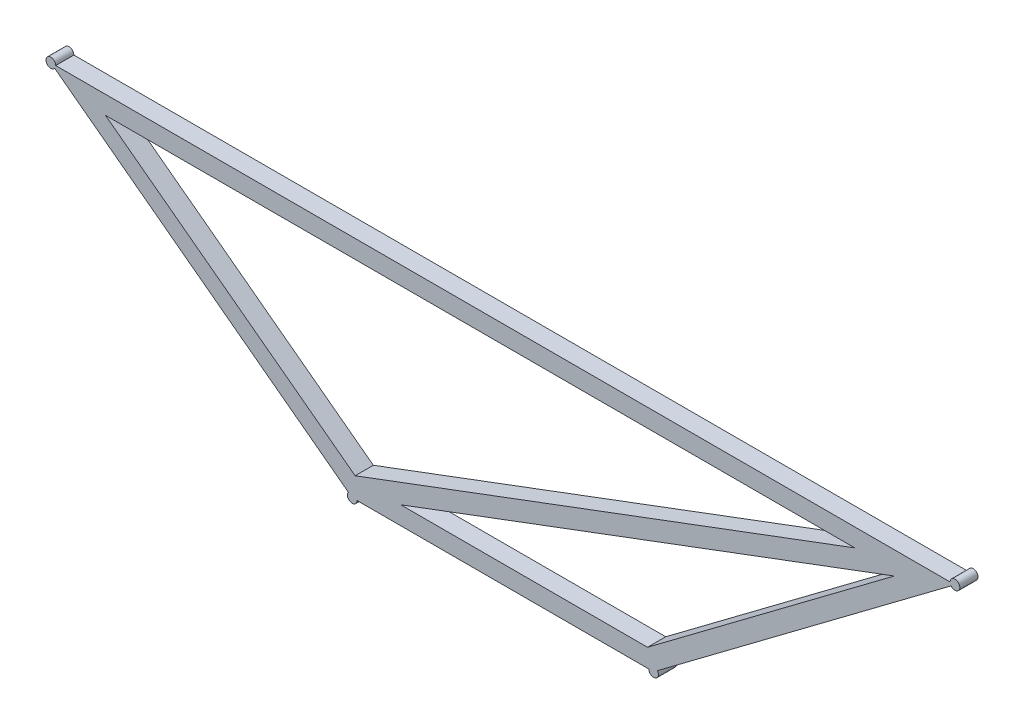
ISO-10303-21;
HEADER;
FILE_DESCRIPTION(('STEP AP214'),'2;1');
FILE_NAME('part.step','',(''),(''),'','','');
FILE_SCHEMA(('AUTOMOTIVE_DESIGN { 1 0 10303 214 1 1 1 1 }'));
ENDSEC;
DATA;
#1=APPLICATION_CONTEXT('core data for automotive mechanical design processes');
#2=APPLICATION_PROTOCOL_DEFINITION('international standard','automotive_design',2000,#1);
#3=PRODUCT_CONTEXT('',#1,'mechanical');
#4=PRODUCT('Part','Part','',(#3));
#5=PRODUCT_RELATED_PRODUCT_CATEGORY('part','',(#4));
#6=PRODUCT_DEFINITION_FORMATION('','',#4);
#7=PRODUCT_DEFINITION_CONTEXT('part definition',#1,'design');
#8=PRODUCT_DEFINITION('design','',#6,#7);
#9=PRODUCT_DEFINITION_SHAPE('','',#8);
#10=(LENGTH_UNIT() NAMED_UNIT(*) SI_UNIT(.MILLI.,.METRE.));
#11=(NAMED_UNIT(*) PLANE_ANGLE_UNIT() SI_UNIT($,.RADIAN.));
#12=(NAMED_UNIT(*) SI_UNIT($,.STERADIAN.) SOLID_ANGLE_UNIT());
#13=UNCERTAINTY_MEASURE_WITH_UNIT(LENGTH_MEASURE(1.E-05),#10,'distance_accuracy_value','');
#14=(GEOMETRIC_REPRESENTATION_CONTEXT(3) GLOBAL_UNCERTAINTY_ASSIGNED_CONTEXT((#13)) GLOBAL_UNIT_ASSIGNED_CONTEXT((#10,
#11,#12)) REPRESENTATION_CONTEXT('',''));
#15=CARTESIAN_POINT('',(0.,0.,0.));
#16=DIRECTION('',(0.,0.,1.));
#17=DIRECTION('',(1.,0.,0.));
#18=AXIS2_PLACEMENT_3D('',#15,#16,#17);
#19=CARTESIAN_POINT('',(-400.,300.,24.14));
#20=DIRECTION('',(0.,0.,1.));
#21=DIRECTION('',(1.,0.,0.));
#22=AXIS2_PLACEMENT_3D('',#19,#20,#21);
#23=PLANE('',#22);
#24=CARTESIAN_POINT('',(-400.,300.,24.14));
#25=DIRECTION('',(0.,0.,1.));
#26=DIRECTION('',(1.,0.,0.));
#27=AXIS2_PLACEMENT_3D('',#24,#25,#26);
#28=CIRCLE('',#27,6.41999999999997);
#29=CARTESIAN_POINT('',(-393.58,300.,24.14));
#30=VERTEX_POINT('',#29);
#31=CARTESIAN_POINT('',(-394.864,296.148,24.14));
#32=VERTEX_POINT('',#31);
#33=EDGE_CURVE('E216',#30,#32,#28,.T.);
#34=ORIENTED_EDGE('',*,*,#33,.T.);
#35=DIRECTION('',(0.8,-0.6,0.));
#36=VECTOR('',#35,1.);
#37=CARTESIAN_POINT('',(-394.864,296.148,24.14));
#38=LINE('',#37,#36);
#39=CARTESIAN_POINT('',(-5.13600000000002,3.85199999999998,24.14));
#40=VERTEX_POINT('',#39);
#41=EDGE_CURVE('E220',#32,#40,#38,.T.);
#42=ORIENTED_EDGE('',*,*,#41,.T.);
#43=CARTESIAN_POINT('',(0.,0.,24.14));
#44=DIRECTION('',(0.,0.,1.));
#45=DIRECTION('',(1.,0.,0.));
#46=AXIS2_PLACEMENT_3D('',#43,#44,#45);
#47=CIRCLE('',#46,6.42);
#48=CARTESIAN_POINT('',(6.42,0.,24.14));
#49=VERTEX_POINT('',#48);
#50=EDGE_CURVE('E224',#40,#49,#47,.T.);
#51=ORIENTED_EDGE('',*,*,#50,.T.);
#52=DIRECTION('',(1.,0.,0.));
#53=VECTOR('',#52,1.);
#54=CARTESIAN_POINT('',(6.42,0.,24.14));
#55=LINE('',#54,#53);
#56=CARTESIAN_POINT('',(393.58,0.,24.14));
#57=VERTEX_POINT('',#56);
#58=EDGE_CURVE('E227',#49,#57,#55,.T.);
#59=ORIENTED_EDGE('',*,*,#58,.T.);
#60=CARTESIAN_POINT('',(400.,0.,24.14));
#61=DIRECTION('',(0.,0.,1.));
#62=DIRECTION('',(1.,0.,0.));
#63=AXIS2_PLACEMENT_3D('',#60,#61,#62);
#64=CIRCLE('',#63,6.41999999999998);
#65=CARTESIAN_POINT('',(405.136,3.85199999999999,24.14));
#66=VERTEX_POINT('',#65);
#67=EDGE_CURVE('E230',#57,#66,#64,.T.);
#68=ORIENTED_EDGE('',*,*,#67,.T.);
#69=DIRECTION('',(0.8,0.6,0.));
#70=VECTOR('',#69,1.);
#71=CARTESIAN_POINT('',(405.136,3.85199999999999,24.14));
#72=LINE('',#71,#70);
#73=CARTESIAN_POINT('',(794.864,296.148,24.14));
#74=VERTEX_POINT('',#73);
#75=EDGE_CURVE('E233',#66,#74,#72,.T.);
#76=ORIENTED_EDGE('',*,*,#75,.T.);
#77=CARTESIAN_POINT('',(800.,300.,24.14));
#78=DIRECTION('',(0.,0.,1.));
#79=DIRECTION('',(1.,0.,0.));
#80=AXIS2_PLACEMENT_3D('',#77,#78,#79);
#81=CIRCLE('',#80,6.41999999999995);
#82=CARTESIAN_POINT('',(793.58,300.,24.14));
#83=VERTEX_POINT('',#82);
#84=EDGE_CURVE('E236',#74,#83,#81,.T.);
#85=ORIENTED_EDGE('',*,*,#84,.T.);
#86=DIRECTION('',(-1.,0.,0.));
#87=VECTOR('',#86,1.);
#88=CARTESIAN_POINT('',(793.58,300.,24.14));
#89=LINE('',#88,#87);
#90=EDGE_CURVE('E239',#83,#30,#89,.T.);
#91=ORIENTED_EDGE('',*,*,#90,.T.);
#92=EDGE_LOOP('',(#34,#42,#51,#59,#68,#76,#85,#91));
#93=FACE_BOUND('',#92,.T.);
#94=DIRECTION('',(0.8,-0.6,0.));
#95=VECTOR('',#94,1.);
#96=CARTESIAN_POINT('',(-327.58,275.86,24.14));
#97=LINE('',#96,#95);
#98=CARTESIAN_POINT('',(-327.58,275.86,24.14));
#99=VERTEX_POINT('',#98);
#100=CARTESIAN_POINT('',(3.90530550978163,27.2460208676638,24.14));
#101=VERTEX_POINT('',#100);
#102=EDGE_CURVE('E186',#99,#101,#97,.T.);
#103=ORIENTED_EDGE('',*,*,#102,.F.);
#104=DIRECTION('',(-1.,0.,0.));
#105=VECTOR('',#104,1.);
#106=CARTESIAN_POINT('',(666.875916529345,275.86,24.14));
#107=LINE('',#106,#105);
#108=CARTESIAN_POINT('',(666.875916529345,275.86,24.14));
#109=VERTEX_POINT('',#108);
#110=EDGE_CURVE('E183',#109,#99,#107,.T.);
#111=ORIENTED_EDGE('',*,*,#110,.F.);
#112=DIRECTION('',(0.936329177569045,0.351123441588392,0.));
#113=VECTOR('',#112,1.);
#114=CARTESIAN_POINT('',(3.90530550978168,27.2460208676638,24.14));
#115=LINE('',#114,#113);
#116=EDGE_CURVE('E191',#101,#109,#115,.T.);
#117=ORIENTED_EDGE('',*,*,#116,.F.);
#118=EDGE_LOOP('',(#103,#111,#117));
#119=FACE_BOUND('',#118,.T.);
#120=DIRECTION('',(-0.936329177569044,-0.351123441588392,0.));
#121=VECTOR('',#120,1.);
#122=CARTESIAN_POINT('',(64.3733333333334,24.14,24.14));
#123=LINE('',#122,#121);
#124=CARTESIAN_POINT('',(719.533333333334,269.825,24.14));
#125=VERTEX_POINT('',#124);
#126=CARTESIAN_POINT('',(64.3733333333333,24.1400000000001,24.14));
#127=VERTEX_POINT('',#126);
#128=EDGE_CURVE('E156',#125,#127,#123,.T.);
#129=ORIENTED_EDGE('',*,*,#128,.F.);
#130=DIRECTION('',(0.8,0.6,0.));
#131=VECTOR('',#130,1.);
#132=CARTESIAN_POINT('',(391.953333333333,24.14,24.14));
#133=LINE('',#132,#131);
#134=CARTESIAN_POINT('',(391.953333333333,24.14,24.14));
#135=VERTEX_POINT('',#134);
#136=EDGE_CURVE('E147',#135,#125,#133,.T.);
#137=ORIENTED_EDGE('',*,*,#136,.F.);
#138=DIRECTION('',(1.,0.,0.));
#139=VECTOR('',#138,1.);
#140=CARTESIAN_POINT('',(64.3733333333334,24.14,24.14));
#141=LINE('',#140,#139);
#142=EDGE_CURVE('E166',#127,#135,#141,.T.);
#143=ORIENTED_EDGE('',*,*,#142,.F.);
#144=EDGE_LOOP('',(#129,#137,#143));
#145=FACE_BOUND('',#144,.T.);
#146=ADVANCED_FACE('F45',(#93,#119,#145),#23,.T.);
#147=CARTESIAN_POINT('',(-400.,300.,0.));
#148=DIRECTION('',(0.,0.,1.));
#149=DIRECTION('',(1.,0.,0.));
#150=AXIS2_PLACEMENT_3D('',#147,#148,#149);
#151=PLANE('',#150);
#152=DIRECTION('',(-1.,0.,0.));
#153=VECTOR('',#152,1.);
#154=CARTESIAN_POINT('',(666.875916529345,275.86,0.));
#155=LINE('',#154,#153);
#156=CARTESIAN_POINT('',(666.875916529345,275.86,0.));
#157=VERTEX_POINT('',#156);
#158=CARTESIAN_POINT('',(-327.58,275.86,0.));
#159=VERTEX_POINT('',#158);
#160=EDGE_CURVE('E164',#157,#159,#155,.T.);
#161=ORIENTED_EDGE('',*,*,#160,.T.);
#162=DIRECTION('',(0.8,-0.6,0.));
#163=VECTOR('',#162,1.);
#164=CARTESIAN_POINT('',(-327.58,275.86,0.));
#165=LINE('',#164,#163);
#166=CARTESIAN_POINT('',(3.90530550978168,27.2460208676638,0.));
#167=VERTEX_POINT('',#166);
#168=EDGE_CURVE('E198',#159,#167,#165,.T.);
#169=ORIENTED_EDGE('',*,*,#168,.T.);
#170=DIRECTION('',(0.936329177569045,0.351123441588392,0.));
#171=VECTOR('',#170,1.);
#172=CARTESIAN_POINT('',(3.90530550978168,27.2460208676638,0.));
#173=LINE('',#172,#171);
#174=EDGE_CURVE('E187',#167,#157,#173,.T.);
#175=ORIENTED_EDGE('',*,*,#174,.T.);
#176=EDGE_LOOP('',(#161,#169,#175));
#177=FACE_BOUND('',#176,.T.);
#178=CARTESIAN_POINT('',(-400.,300.,0.));
#179=DIRECTION('',(0.,0.,1.));
#180=DIRECTION('',(1.,0.,0.));
#181=AXIS2_PLACEMENT_3D('',#178,#179,#180);
#182=CIRCLE('',#181,6.41999999999997);
#183=CARTESIAN_POINT('',(-393.58,300.,0.));
#184=VERTEX_POINT('',#183);
#185=CARTESIAN_POINT('',(-394.864,296.148,0.));
#186=VERTEX_POINT('',#185);
#187=EDGE_CURVE('E215',#184,#186,#182,.T.);
#188=ORIENTED_EDGE('',*,*,#187,.F.);
#189=DIRECTION('',(-1.,0.,0.));
#190=VECTOR('',#189,1.);
#191=CARTESIAN_POINT('',(793.58,300.,0.));
#192=LINE('',#191,#190);
#193=CARTESIAN_POINT('',(793.58,300.,0.));
#194=VERTEX_POINT('',#193);
#195=EDGE_CURVE('E221',#194,#184,#192,.T.);
#196=ORIENTED_EDGE('',*,*,#195,.F.);
#197=CARTESIAN_POINT('',(800.,300.,0.));
#198=DIRECTION('',(0.,0.,1.));
#199=DIRECTION('',(1.,0.,0.));
#200=AXIS2_PLACEMENT_3D('',#197,#198,#199);
#201=CIRCLE('',#200,6.41999999999995);
#202=CARTESIAN_POINT('',(794.864,296.148,0.));
#203=VERTEX_POINT('',#202);
#204=EDGE_CURVE('E261',#203,#194,#201,.T.);
#205=ORIENTED_EDGE('',*,*,#204,.F.);
#206=DIRECTION('',(0.8,0.6,0.));
#207=VECTOR('',#206,1.);
#208=CARTESIAN_POINT('',(405.136,3.85199999999999,0.));
#209=LINE('',#208,#207);
#210=CARTESIAN_POINT('',(405.136,3.85199999999999,0.));
#211=VERTEX_POINT('',#210);
#212=EDGE_CURVE('E258',#211,#203,#209,.T.);
#213=ORIENTED_EDGE('',*,*,#212,.F.);
#214=CARTESIAN_POINT('',(400.,0.,0.));
#215=DIRECTION('',(0.,0.,1.));
#216=DIRECTION('',(1.,0.,0.));
#217=AXIS2_PLACEMENT_3D('',#214,#215,#216);
#218=CIRCLE('',#217,6.41999999999998);
#219=CARTESIAN_POINT('',(393.58,0.,0.));
#220=VERTEX_POINT('',#219);
#221=EDGE_CURVE('E255',#220,#211,#218,.T.);
#222=ORIENTED_EDGE('',*,*,#221,.F.);
#223=DIRECTION('',(1.,0.,0.));
#224=VECTOR('',#223,1.);
#225=CARTESIAN_POINT('',(6.42,0.,0.));
#226=LINE('',#225,#224);
#227=CARTESIAN_POINT('',(6.42,0.,0.));
#228=VERTEX_POINT('',#227);
#229=EDGE_CURVE('E252',#228,#220,#226,.T.);
#230=ORIENTED_EDGE('',*,*,#229,.F.);
#231=CARTESIAN_POINT('',(0.,0.,0.));
#232=DIRECTION('',(0.,0.,1.));
#233=DIRECTION('',(1.,0.,0.));
#234=AXIS2_PLACEMENT_3D('',#231,#232,#233);
#235=CIRCLE('',#234,6.42);
#236=CARTESIAN_POINT('',(-5.13600000000002,3.85199999999998,0.));
#237=VERTEX_POINT('',#236);
#238=EDGE_CURVE('E249',#237,#228,#235,.T.);
#239=ORIENTED_EDGE('',*,*,#238,.F.);
#240=DIRECTION('',(0.8,-0.6,0.));
#241=VECTOR('',#240,1.);
#242=CARTESIAN_POINT('',(-394.864,296.148,0.));
#243=LINE('',#242,#241);
#244=EDGE_CURVE('E246',#186,#237,#243,.T.);
#245=ORIENTED_EDGE('',*,*,#244,.F.);
#246=EDGE_LOOP('',(#188,#196,#205,#213,#222,#230,#239,#245));
#247=FACE_BOUND('',#246,.T.);
#248=DIRECTION('',(0.8,0.6,0.));
#249=VECTOR('',#248,1.);
#250=CARTESIAN_POINT('',(391.953333333333,24.14,0.));
#251=LINE('',#250,#249);
#252=CARTESIAN_POINT('',(391.953333333333,24.1400000000001,0.));
#253=VERTEX_POINT('',#252);
#254=CARTESIAN_POINT('',(719.533333333334,269.825,0.));
#255=VERTEX_POINT('',#254);
#256=EDGE_CURVE('E69',#253,#255,#251,.T.);
#257=ORIENTED_EDGE('',*,*,#256,.T.);
#258=DIRECTION('',(-0.936329177569044,-0.351123441588392,0.));
#259=VECTOR('',#258,1.);
#260=CARTESIAN_POINT('',(64.3733333333334,24.14,0.));
#261=LINE('',#260,#259);
#262=CARTESIAN_POINT('',(64.3733333333334,24.14,0.));
#263=VERTEX_POINT('',#262);
#264=EDGE_CURVE('E162',#255,#263,#261,.T.);
#265=ORIENTED_EDGE('',*,*,#264,.T.);
#266=DIRECTION('',(1.,0.,0.));
#267=VECTOR('',#266,1.);
#268=CARTESIAN_POINT('',(64.3733333333334,24.14,0.));
#269=LINE('',#268,#267);
#270=EDGE_CURVE('E157',#263,#253,#269,.T.);
#271=ORIENTED_EDGE('',*,*,#270,.T.);
#272=EDGE_LOOP('',(#257,#265,#271));
#273=FACE_BOUND('',#272,.T.);
#274=ADVANCED_FACE('F300',(#177,#247,#273),#151,.F.);
#275=CARTESIAN_POINT('',(-400.,300.,24.14));
#276=DIRECTION('',(0.,0.,-1.));
#277=DIRECTION('',(-1.,0.,0.));
#278=AXIS2_PLACEMENT_3D('',#275,#276,#277);
#279=CYLINDRICAL_SURFACE('',#278,6.41999999999997);
#280=ORIENTED_EDGE('',*,*,#187,.T.);
#281=DIRECTION('',(0.,0.,-1.));
#282=VECTOR('',#281,1.);
#283=CARTESIAN_POINT('',(-394.864,296.148,24.14));
#284=LINE('',#283,#282);
#285=EDGE_CURVE('E11',#32,#186,#284,.T.);
#286=ORIENTED_EDGE('',*,*,#285,.F.);
#287=ORIENTED_EDGE('',*,*,#33,.F.);
#288=DIRECTION('',(0.,0.,-1.));
#289=VECTOR('',#288,1.);
#290=CARTESIAN_POINT('',(-393.58,300.,24.14));
#291=LINE('',#290,#289);
#292=EDGE_CURVE('E242',#30,#184,#291,.T.);
#293=ORIENTED_EDGE('',*,*,#292,.T.);
#294=EDGE_LOOP('',(#280,#286,#287,#293));
#295=FACE_BOUND('',#294,.T.);
#296=ADVANCED_FACE('F47',(#295),#279,.T.);
#297=CARTESIAN_POINT('',(-394.864,296.148,24.14));
#298=DIRECTION('',(0.6,0.8,0.));
#299=DIRECTION('',(-0.8,0.6,0.));
#300=AXIS2_PLACEMENT_3D('',#297,#298,#299);
#301=PLANE('',#300);
#302=ORIENTED_EDGE('',*,*,#244,.T.);
#303=DIRECTION('',(0.,0.,-1.));
#304=VECTOR('',#303,1.);
#305=CARTESIAN_POINT('',(-5.13600000000002,3.85199999999998,24.14));
#306=LINE('',#305,#304);
#307=EDGE_CURVE('E54',#40,#237,#306,.T.);
#308=ORIENTED_EDGE('',*,*,#307,.F.);
#309=ORIENTED_EDGE('',*,*,#41,.F.);
#310=ORIENTED_EDGE('',*,*,#285,.T.);
#311=EDGE_LOOP('',(#302,#308,#309,#310));
#312=FACE_BOUND('',#311,.T.);
#313=ADVANCED_FACE('F318',(#312),#301,.F.);
#314=CARTESIAN_POINT('',(0.,0.,24.14));
#315=DIRECTION('',(0.,0.,-1.));
#316=DIRECTION('',(-1.,0.,0.));
#317=AXIS2_PLACEMENT_3D('',#314,#315,#316);
#318=CYLINDRICAL_SURFACE('',#317,6.42);
#319=ORIENTED_EDGE('',*,*,#238,.T.);
#320=DIRECTION('',(0.,0.,-1.));
#321=VECTOR('',#320,1.);
#322=CARTESIAN_POINT('',(6.42,0.,24.14));
#323=LINE('',#322,#321);
#324=EDGE_CURVE('E285',#49,#228,#323,.T.);
#325=ORIENTED_EDGE('',*,*,#324,.F.);
#326=ORIENTED_EDGE('',*,*,#50,.F.);
#327=ORIENTED_EDGE('',*,*,#307,.T.);
#328=EDGE_LOOP('',(#319,#325,#326,#327));
#329=FACE_BOUND('',#328,.T.);
#330=ADVANCED_FACE('F294',(#329),#318,.T.);
#331=CARTESIAN_POINT('',(6.42,0.,24.14));
#332=DIRECTION('',(0.,1.,0.));
#333=DIRECTION('',(0.,0.,1.));
#334=AXIS2_PLACEMENT_3D('',#331,#332,#333);
#335=PLANE('',#334);
#336=ORIENTED_EDGE('',*,*,#229,.T.);
#337=DIRECTION('',(0.,0.,-1.));
#338=VECTOR('',#337,1.);
#339=CARTESIAN_POINT('',(393.58,0.,24.14));
#340=LINE('',#339,#338);
#341=EDGE_CURVE('E281',#57,#220,#340,.T.);
#342=ORIENTED_EDGE('',*,*,#341,.F.);
#343=ORIENTED_EDGE('',*,*,#58,.F.);
#344=ORIENTED_EDGE('',*,*,#324,.T.);
#345=EDGE_LOOP('',(#336,#342,#343,#344));
#346=FACE_BOUND('',#345,.T.);
#347=ADVANCED_FACE('F306',(#346),#335,.F.);
#348=CARTESIAN_POINT('',(400.,0.,24.14));
#349=DIRECTION('',(0.,0.,-1.));
#350=DIRECTION('',(-1.,0.,0.));
#351=AXIS2_PLACEMENT_3D('',#348,#349,#350);
#352=CYLINDRICAL_SURFACE('',#351,6.41999999999998);
#353=ORIENTED_EDGE('',*,*,#221,.T.);
#354=DIRECTION('',(0.,0.,-1.));
#355=VECTOR('',#354,1.);
#356=CARTESIAN_POINT('',(405.136,3.85199999999999,24.14));
#357=LINE('',#356,#355);
#358=EDGE_CURVE('E277',#66,#211,#357,.T.);
#359=ORIENTED_EDGE('',*,*,#358,.F.);
#360=ORIENTED_EDGE('',*,*,#67,.F.);
#361=ORIENTED_EDGE('',*,*,#341,.T.);
#362=EDGE_LOOP('',(#353,#359,#360,#361));
#363=FACE_BOUND('',#362,.T.);
#364=ADVANCED_FACE('F310',(#363),#352,.T.);
#365=CARTESIAN_POINT('',(405.136,3.85199999999999,24.14));
#366=DIRECTION('',(-0.6,0.8,0.));
#367=DIRECTION('',(-0.8,-0.6,0.));
#368=AXIS2_PLACEMENT_3D('',#365,#366,#367);
#369=PLANE('',#368);
#370=ORIENTED_EDGE('',*,*,#212,.T.);
#371=DIRECTION('',(0.,0.,-1.));
#372=VECTOR('',#371,1.);
#373=CARTESIAN_POINT('',(794.864,296.148,24.14));
#374=LINE('',#373,#372);
#375=EDGE_CURVE('E273',#74,#203,#374,.T.);
#376=ORIENTED_EDGE('',*,*,#375,.F.);
#377=ORIENTED_EDGE('',*,*,#75,.F.);
#378=ORIENTED_EDGE('',*,*,#358,.T.);
#379=EDGE_LOOP('',(#370,#376,#377,#378));
#380=FACE_BOUND('',#379,.T.);
#381=ADVANCED_FACE('F331',(#380),#369,.F.);
#382=CARTESIAN_POINT('',(800.,300.,24.14));
#383=DIRECTION('',(0.,0.,-1.));
#384=DIRECTION('',(-1.,0.,0.));
#385=AXIS2_PLACEMENT_3D('',#382,#383,#384);
#386=CYLINDRICAL_SURFACE('',#385,6.41999999999995);
#387=ORIENTED_EDGE('',*,*,#204,.T.);
#388=DIRECTION('',(0.,0.,-1.));
#389=VECTOR('',#388,1.);
#390=CARTESIAN_POINT('',(793.58,300.,24.14));
#391=LINE('',#390,#389);
#392=EDGE_CURVE('E269',#83,#194,#391,.T.);
#393=ORIENTED_EDGE('',*,*,#392,.F.);
#394=ORIENTED_EDGE('',*,*,#84,.F.);
#395=ORIENTED_EDGE('',*,*,#375,.T.);
#396=EDGE_LOOP('',(#387,#393,#394,#395));
#397=FACE_BOUND('',#396,.T.);
#398=ADVANCED_FACE('F329',(#397),#386,.T.);
#399=CARTESIAN_POINT('',(793.58,300.,24.14));
#400=DIRECTION('',(0.,-1.,0.));
#401=DIRECTION('',(1.,0.,0.));
#402=AXIS2_PLACEMENT_3D('',#399,#400,#401);
#403=PLANE('',#402);
#404=ORIENTED_EDGE('',*,*,#195,.T.);
#405=ORIENTED_EDGE('',*,*,#292,.F.);
#406=ORIENTED_EDGE('',*,*,#90,.F.);
#407=ORIENTED_EDGE('',*,*,#392,.T.);
#408=EDGE_LOOP('',(#404,#405,#406,#407));
#409=FACE_BOUND('',#408,.T.);
#410=ADVANCED_FACE('F324',(#409),#403,.F.);
#411=CARTESIAN_POINT('',(666.875916529345,275.86,24.14));
#412=DIRECTION('',(0.,-1.,0.));
#413=DIRECTION('',(1.,0.,0.));
#414=AXIS2_PLACEMENT_3D('',#411,#412,#413);
#415=PLANE('',#414);
#416=ORIENTED_EDGE('',*,*,#160,.F.);
#417=DIRECTION('',(0.,0.,-1.));
#418=VECTOR('',#417,1.);
#419=CARTESIAN_POINT('',(666.875916529345,275.86,24.14));
#420=LINE('',#419,#418);
#421=EDGE_CURVE('E194',#109,#157,#420,.T.);
#422=ORIENTED_EDGE('',*,*,#421,.F.);
#423=ORIENTED_EDGE('',*,*,#110,.T.);
#424=DIRECTION('',(0.,0.,-1.));
#425=VECTOR('',#424,1.);
#426=CARTESIAN_POINT('',(-327.58,275.86,24.14));
#427=LINE('',#426,#425);
#428=EDGE_CURVE('E211',#99,#159,#427,.T.);
#429=ORIENTED_EDGE('',*,*,#428,.T.);
#430=EDGE_LOOP('',(#416,#422,#423,#429));
#431=FACE_BOUND('',#430,.T.);
#432=ADVANCED_FACE('F348',(#431),#415,.T.);
#433=CARTESIAN_POINT('',(-327.58,275.86,24.14));
#434=DIRECTION('',(0.6,0.8,0.));
#435=DIRECTION('',(-0.8,0.6,0.));
#436=AXIS2_PLACEMENT_3D('',#433,#434,#435);
#437=PLANE('',#436);
#438=ORIENTED_EDGE('',*,*,#168,.F.);
#439=ORIENTED_EDGE('',*,*,#428,.F.);
#440=ORIENTED_EDGE('',*,*,#102,.T.);
#441=DIRECTION('',(0.,0.,-1.));
#442=VECTOR('',#441,1.);
#443=CARTESIAN_POINT('',(3.90530550978168,27.2460208676638,24.14));
#444=LINE('',#443,#442);
#445=EDGE_CURVE('E208',#101,#167,#444,.T.);
#446=ORIENTED_EDGE('',*,*,#445,.T.);
#447=EDGE_LOOP('',(#438,#439,#440,#446));
#448=FACE_BOUND('',#447,.T.);
#449=ADVANCED_FACE('F355',(#448),#437,.T.);
#450=CARTESIAN_POINT('',(3.90530550978168,27.2460208676638,24.14));
#451=DIRECTION('',(-0.351123441588392,0.936329177569045,0.));
#452=DIRECTION('',(-0.936329177569045,-0.351123441588392,0.));
#453=AXIS2_PLACEMENT_3D('',#450,#451,#452);
#454=PLANE('',#453);
#455=ORIENTED_EDGE('',*,*,#174,.F.);
#456=ORIENTED_EDGE('',*,*,#445,.F.);
#457=ORIENTED_EDGE('',*,*,#116,.T.);
#458=ORIENTED_EDGE('',*,*,#421,.T.);
#459=EDGE_LOOP('',(#455,#456,#457,#458));
#460=FACE_BOUND('',#459,.T.);
#461=ADVANCED_FACE('F360',(#460),#454,.T.);
#462=CARTESIAN_POINT('',(391.953333333333,24.14,24.14));
#463=DIRECTION('',(-0.6,0.8,0.));
#464=DIRECTION('',(-0.8,-0.6,0.));
#465=AXIS2_PLACEMENT_3D('',#462,#463,#464);
#466=PLANE('',#465);
#467=ORIENTED_EDGE('',*,*,#256,.F.);
#468=DIRECTION('',(0.,0.,-1.));
#469=VECTOR('',#468,1.);
#470=CARTESIAN_POINT('',(391.953333333333,24.14,24.14));
#471=LINE('',#470,#469);
#472=EDGE_CURVE('E151',#135,#253,#471,.T.);
#473=ORIENTED_EDGE('',*,*,#472,.F.);
#474=ORIENTED_EDGE('',*,*,#136,.T.);
#475=DIRECTION('',(0.,0.,-1.));
#476=VECTOR('',#475,1.);
#477=CARTESIAN_POINT('',(719.533333333334,269.825,24.14));
#478=LINE('',#477,#476);
#479=EDGE_CURVE('E150',#125,#255,#478,.T.);
#480=ORIENTED_EDGE('',*,*,#479,.T.);
#481=EDGE_LOOP('',(#467,#473,#474,#480));
#482=FACE_BOUND('',#481,.T.);
#483=ADVANCED_FACE('F149',(#482),#466,.T.);
#484=CARTESIAN_POINT('',(64.3733333333334,24.14,24.14));
#485=DIRECTION('',(0.351123441588392,-0.936329177569044,0.));
#486=DIRECTION('',(0.936329177569044,0.351123441588392,0.));
#487=AXIS2_PLACEMENT_3D('',#484,#485,#486);
#488=PLANE('',#487);
#489=ORIENTED_EDGE('',*,*,#264,.F.);
#490=ORIENTED_EDGE('',*,*,#479,.F.);
#491=ORIENTED_EDGE('',*,*,#128,.T.);
#492=DIRECTION('',(0.,0.,-1.));
#493=VECTOR('',#492,1.);
#494=CARTESIAN_POINT('',(64.3733333333334,24.14,24.14));
#495=LINE('',#494,#493);
#496=EDGE_CURVE('E61',#127,#263,#495,.T.);
#497=ORIENTED_EDGE('',*,*,#496,.T.);
#498=EDGE_LOOP('',(#489,#490,#491,#497));
#499=FACE_BOUND('',#498,.T.);
#500=ADVANCED_FACE('F160',(#499),#488,.T.);
#501=CARTESIAN_POINT('',(64.3733333333334,24.14,24.14));
#502=DIRECTION('',(0.,1.,0.));
#503=DIRECTION('',(-1.,0.,0.));
#504=AXIS2_PLACEMENT_3D('',#501,#502,#503);
#505=PLANE('',#504);
#506=ORIENTED_EDGE('',*,*,#270,.F.);
#507=ORIENTED_EDGE('',*,*,#496,.F.);
#508=ORIENTED_EDGE('',*,*,#142,.T.);
#509=ORIENTED_EDGE('',*,*,#472,.T.);
#510=EDGE_LOOP('',(#506,#507,#508,#509));
#511=FACE_BOUND('',#510,.T.);
#512=ADVANCED_FACE('F378',(#511),#505,.T.);
#513=CLOSED_SHELL('',(#146,#274,#296,#313,#330,#347,#364,#381,#398,#410,#432,#449,#461,#483,
#500,#512));
#514=MANIFOLD_SOLID_BREP('B2',#513);
#515=ADVANCED_BREP_SHAPE_REPRESENTATION('',(#18,#514),#14);
#516=SHAPE_DEFINITION_REPRESENTATION(#9,#515);
ENDSEC;
END-ISO-10303-21;
